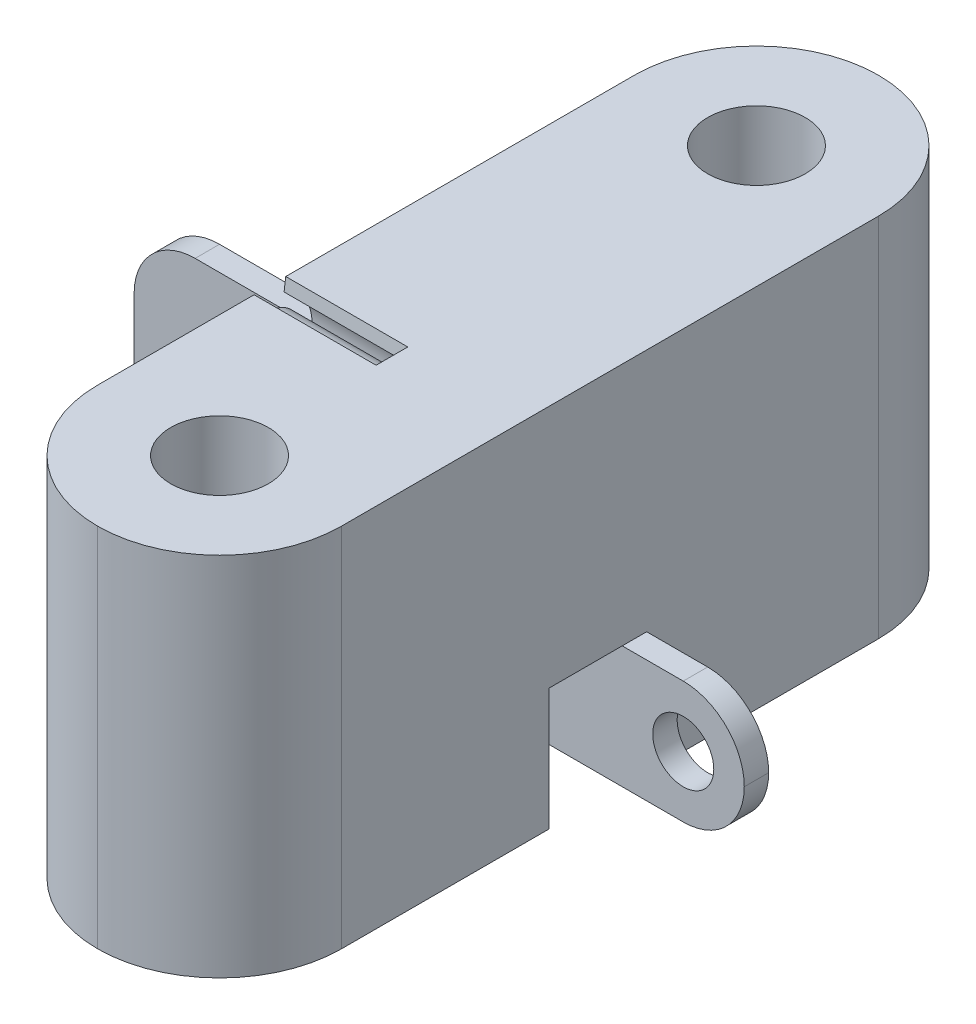
ISO-10303-21;
HEADER;
FILE_DESCRIPTION(('STEP AP214'),'2;1');
FILE_NAME('part.step','',(''),(''),'','','');
FILE_SCHEMA(('AUTOMOTIVE_DESIGN { 1 0 10303 214 1 1 1 1 }'));
ENDSEC;
DATA;
#1=APPLICATION_CONTEXT('core data for automotive mechanical design processes');
#2=APPLICATION_PROTOCOL_DEFINITION('international standard','automotive_design',2000,#1);
#3=PRODUCT_CONTEXT('',#1,'mechanical');
#4=PRODUCT('Part','Part','',(#3));
#5=PRODUCT_RELATED_PRODUCT_CATEGORY('part','',(#4));
#6=PRODUCT_DEFINITION_FORMATION('','',#4);
#7=PRODUCT_DEFINITION_CONTEXT('part definition',#1,'design');
#8=PRODUCT_DEFINITION('design','',#6,#7);
#9=PRODUCT_DEFINITION_SHAPE('','',#8);
#10=(LENGTH_UNIT() NAMED_UNIT(*) SI_UNIT(.MILLI.,.METRE.));
#11=(NAMED_UNIT(*) PLANE_ANGLE_UNIT() SI_UNIT($,.RADIAN.));
#12=(NAMED_UNIT(*) SI_UNIT($,.STERADIAN.) SOLID_ANGLE_UNIT());
#13=UNCERTAINTY_MEASURE_WITH_UNIT(LENGTH_MEASURE(1.E-05),#10,'distance_accuracy_value','');
#14=(GEOMETRIC_REPRESENTATION_CONTEXT(3) GLOBAL_UNCERTAINTY_ASSIGNED_CONTEXT((#13)) GLOBAL_UNIT_ASSIGNED_CONTEXT((#10,
#11,#12)) REPRESENTATION_CONTEXT('',''));
#15=CARTESIAN_POINT('',(0.,0.,0.));
#16=DIRECTION('',(0.,0.,1.));
#17=DIRECTION('',(1.,0.,0.));
#18=AXIS2_PLACEMENT_3D('',#15,#16,#17);
#19=CARTESIAN_POINT('',(0.,0.,0.));
#20=DIRECTION('',(0.,1.,0.));
#21=DIRECTION('',(0.,0.,1.));
#22=AXIS2_PLACEMENT_3D('',#19,#20,#21);
#23=PLANE('',#22);
#24=DIRECTION('',(0.,0.,1.));
#25=VECTOR('',#24,1.);
#26=CARTESIAN_POINT('',(-3.52238805970147,0.,-23.7611940298507));
#27=LINE('',#26,#25);
#28=CARTESIAN_POINT('',(-3.52238805970146,0.,13.2388059701493));
#29=VERTEX_POINT('',#28);
#30=CARTESIAN_POINT('',(-3.52238805970146,0.,30.2388059701493));
#31=VERTEX_POINT('',#30);
#32=EDGE_CURVE('E265',#29,#31,#27,.T.);
#33=ORIENTED_EDGE('',*,*,#32,.F.);
#34=DIRECTION('',(-1.,0.,0.));
#35=VECTOR('',#34,1.);
#36=CARTESIAN_POINT('',(-4.02238805970147,0.,13.2388059701493));
#37=LINE('',#36,#35);
#38=CARTESIAN_POINT('',(16.4776119402985,0.,13.2388059701493));
#39=VERTEX_POINT('',#38);
#40=EDGE_CURVE('E207',#39,#29,#37,.T.);
#41=ORIENTED_EDGE('',*,*,#40,.F.);
#42=DIRECTION('',(0.,0.,-1.));
#43=VECTOR('',#42,1.);
#44=CARTESIAN_POINT('',(16.4776119402985,0.,-23.7611940298507));
#45=LINE('',#44,#43);
#46=CARTESIAN_POINT('',(16.4776119402985,0.,30.2388059701493));
#47=VERTEX_POINT('',#46);
#48=EDGE_CURVE('E283',#47,#39,#45,.T.);
#49=ORIENTED_EDGE('',*,*,#48,.F.);
#50=CARTESIAN_POINT('',(6.47761194029854,0.,30.2388059701493));
#51=DIRECTION('',(0.,1.,0.));
#52=DIRECTION('',(0.,0.,1.));
#53=AXIS2_PLACEMENT_3D('',#50,#51,#52);
#54=CIRCLE('',#53,10.);
#55=CARTESIAN_POINT('',(6.47761194029854,0.,40.2388059701493));
#56=VERTEX_POINT('',#55);
#57=EDGE_CURVE('E293',#47,#56,#54,.F.);
#58=ORIENTED_EDGE('',*,*,#57,.T.);
#59=CARTESIAN_POINT('',(6.47761194029854,0.,30.2388059701493));
#60=DIRECTION('',(0.,1.,0.));
#61=DIRECTION('',(0.,0.,1.));
#62=AXIS2_PLACEMENT_3D('',#59,#60,#61);
#63=CIRCLE('',#62,10.);
#64=EDGE_CURVE('E290',#56,#31,#63,.F.);
#65=ORIENTED_EDGE('',*,*,#64,.T.);
#66=EDGE_LOOP('',(#33,#41,#49,#58,#65));
#67=FACE_BOUND('',#66,.T.);
#68=ADVANCED_FACE('F33',(#67),#23,.F.);
#69=CARTESIAN_POINT('',(-3.52238805970147,30.,-23.7611940298507));
#70=DIRECTION('',(1.,0.,0.));
#71=DIRECTION('',(0.,0.,-1.));
#72=AXIS2_PLACEMENT_3D('',#69,#70,#71);
#73=PLANE('',#72);
#74=DIRECTION('',(0.,0.,1.));
#75=VECTOR('',#74,1.);
#76=CARTESIAN_POINT('',(-3.52238805970147,10.,-23.7611940298507));
#77=LINE('',#76,#75);
#78=CARTESIAN_POINT('',(-3.52238805970147,10.,7.23880597014926));
#79=VERTEX_POINT('',#78);
#80=CARTESIAN_POINT('',(-3.52238805970146,10.,13.2388059701493));
#81=VERTEX_POINT('',#80);
#82=EDGE_CURVE('E186',#79,#81,#77,.T.);
#83=ORIENTED_EDGE('',*,*,#82,.T.);
#84=DIRECTION('',(0.,-1.,0.));
#85=VECTOR('',#84,1.);
#86=CARTESIAN_POINT('',(-3.52238805970146,30.,13.2388059701493));
#87=LINE('',#86,#85);
#88=EDGE_CURVE('E360',#81,#29,#87,.T.);
#89=ORIENTED_EDGE('',*,*,#88,.T.);
#90=ORIENTED_EDGE('',*,*,#32,.T.);
#91=DIRECTION('',(0.,-1.,0.));
#92=VECTOR('',#91,1.);
#93=CARTESIAN_POINT('',(-3.52238805970146,30.,30.2388059701493));
#94=LINE('',#93,#92);
#95=CARTESIAN_POINT('',(-3.52238805970146,30.,30.2388059701493));
#96=VERTEX_POINT('',#95);
#97=EDGE_CURVE('E279',#31,#96,#94,.F.);
#98=ORIENTED_EDGE('',*,*,#97,.T.);
#99=DIRECTION('',(0.,0.,1.));
#100=VECTOR('',#99,1.);
#101=CARTESIAN_POINT('',(-3.52238805970147,30.,-23.7611940298507));
#102=LINE('',#101,#100);
#103=CARTESIAN_POINT('',(-3.52238805970146,30.,17.4075983617578));
#104=VERTEX_POINT('',#103);
#105=EDGE_CURVE('E277',#104,#96,#102,.T.);
#106=ORIENTED_EDGE('',*,*,#105,.F.);
#107=DIRECTION('',(0.,-0.998274373174996,-0.0587220219514735));
#108=VECTOR('',#107,1.);
#109=CARTESIAN_POINT('',(-3.52238805970146,-0.916997145344465,15.5889514708551));
#110=LINE('',#109,#108);
#111=CARTESIAN_POINT('',(-3.52238805970146,28.9802150072761,17.3476110092446));
#112=VERTEX_POINT('',#111);
#113=EDGE_CURVE('E247',#104,#112,#110,.T.);
#114=ORIENTED_EDGE('',*,*,#113,.T.);
#115=CARTESIAN_POINT('',(-3.52238805970146,25.6865831727299,16.1635547021105));
#116=DIRECTION('',(-1.,0.,0.));
#117=DIRECTION('',(0.,0.,1.));
#118=AXIS2_PLACEMENT_3D('',#115,#116,#117);
#119=CIRCLE('',#118,3.5);
#120=CARTESIAN_POINT('',(-3.52238805970146,28.9694464253818,14.9499613334784));
#121=VERTEX_POINT('',#120);
#122=EDGE_CURVE('E243',#121,#112,#119,.T.);
#123=ORIENTED_EDGE('',*,*,#122,.F.);
#124=DIRECTION('',(0.,0.991227900682634,-0.132163720091024));
#125=VECTOR('',#124,1.);
#126=CARTESIAN_POINT('',(-3.52238805970146,2.46452674980748,18.4839506235552));
#127=LINE('',#126,#125);
#128=CARTESIAN_POINT('',(-3.52238805970146,30.,14.812554190196));
#129=VERTEX_POINT('',#128);
#130=EDGE_CURVE('E240',#121,#129,#127,.T.);
#131=ORIENTED_EDGE('',*,*,#130,.T.);
#132=CARTESIAN_POINT('',(-3.52238805970147,30.,-13.7611940298507));
#133=VERTEX_POINT('',#132);
#134=EDGE_CURVE('E274',#133,#129,#102,.T.);
#135=ORIENTED_EDGE('',*,*,#134,.F.);
#136=DIRECTION('',(0.,-1.,0.));
#137=VECTOR('',#136,1.);
#138=CARTESIAN_POINT('',(-3.52238805970147,30.,-13.7611940298507));
#139=LINE('',#138,#137);
#140=CARTESIAN_POINT('',(-3.52238805970147,0.,-13.7611940298507));
#141=VERTEX_POINT('',#140);
#142=EDGE_CURVE('E287',#133,#141,#139,.T.);
#143=ORIENTED_EDGE('',*,*,#142,.T.);
#144=CARTESIAN_POINT('',(-3.52238805970146,0.,5.23880597014926));
#145=VERTEX_POINT('',#144);
#146=EDGE_CURVE('E280',#141,#145,#27,.T.);
#147=ORIENTED_EDGE('',*,*,#146,.T.);
#148=DIRECTION('',(0.,1.,0.));
#149=VECTOR('',#148,1.);
#150=CARTESIAN_POINT('',(-3.52238805970146,30.,5.23880597014926));
#151=LINE('',#150,#149);
#152=CARTESIAN_POINT('',(-3.52238805970146,20.,5.23880597014926));
#153=VERTEX_POINT('',#152);
#154=EDGE_CURVE('E217',#145,#153,#151,.T.);
#155=ORIENTED_EDGE('',*,*,#154,.T.);
#156=DIRECTION('',(0.,0.,-1.));
#157=VECTOR('',#156,1.);
#158=CARTESIAN_POINT('',(-3.52238805970146,20.,40.2398059701493));
#159=LINE('',#158,#157);
#160=CARTESIAN_POINT('',(-3.52238805970146,20.,7.23880597014926));
#161=VERTEX_POINT('',#160);
#162=EDGE_CURVE('E212',#161,#153,#159,.T.);
#163=ORIENTED_EDGE('',*,*,#162,.F.);
#164=DIRECTION('',(0.,-1.,0.));
#165=VECTOR('',#164,1.);
#166=CARTESIAN_POINT('',(-3.52238805970146,30.,7.23880597014926));
#167=LINE('',#166,#165);
#168=EDGE_CURVE('E205',#161,#79,#167,.T.);
#169=ORIENTED_EDGE('',*,*,#168,.T.);
#170=EDGE_LOOP('',(#83,#89,#90,#98,#106,#114,#123,#131,#135,#143,#147,#155,#163,#169));
#171=FACE_BOUND('',#170,.T.);
#172=ADVANCED_FACE('F210',(#171),#73,.F.);
#173=CARTESIAN_POINT('',(0.,30.,0.));
#174=DIRECTION('',(0.,1.,0.));
#175=DIRECTION('',(0.,0.,1.));
#176=AXIS2_PLACEMENT_3D('',#173,#174,#175);
#177=PLANE('',#176);
#178=ORIENTED_EDGE('',*,*,#134,.T.);
#179=DIRECTION('',(-1.,0.,0.));
#180=VECTOR('',#179,1.);
#181=CARTESIAN_POINT('',(6.47761194029853,30.,14.812554190196));
#182=LINE('',#181,#180);
#183=CARTESIAN_POINT('',(6.47761194029853,30.,14.812554190196));
#184=VERTEX_POINT('',#183);
#185=EDGE_CURVE('E252',#184,#129,#182,.T.);
#186=ORIENTED_EDGE('',*,*,#185,.F.);
#187=DIRECTION('',(0.,0.,-1.));
#188=VECTOR('',#187,1.);
#189=CARTESIAN_POINT('',(6.47761194029853,30.,0.));
#190=LINE('',#189,#188);
#191=CARTESIAN_POINT('',(6.47761194029853,30.,17.4075983617578));
#192=VERTEX_POINT('',#191);
#193=EDGE_CURVE('E233',#192,#184,#190,.T.);
#194=ORIENTED_EDGE('',*,*,#193,.F.);
#195=DIRECTION('',(-1.,0.,0.));
#196=VECTOR('',#195,1.);
#197=CARTESIAN_POINT('',(6.47761194029853,30.,17.4075983617578));
#198=LINE('',#197,#196);
#199=EDGE_CURVE('E256',#192,#104,#198,.T.);
#200=ORIENTED_EDGE('',*,*,#199,.T.);
#201=ORIENTED_EDGE('',*,*,#105,.T.);
#202=CARTESIAN_POINT('',(6.47761194029854,30.,30.2388059701493));
#203=DIRECTION('',(0.,1.,0.));
#204=DIRECTION('',(0.,0.,1.));
#205=AXIS2_PLACEMENT_3D('',#202,#203,#204);
#206=CIRCLE('',#205,10.);
#207=CARTESIAN_POINT('',(6.47761194029854,30.,40.2388059701493));
#208=VERTEX_POINT('',#207);
#209=EDGE_CURVE('E300',#96,#208,#206,.T.);
#210=ORIENTED_EDGE('',*,*,#209,.T.);
#211=CARTESIAN_POINT('',(6.47761194029854,30.,30.2388059701493));
#212=DIRECTION('',(0.,1.,0.));
#213=DIRECTION('',(0.,0.,1.));
#214=AXIS2_PLACEMENT_3D('',#211,#212,#213);
#215=CIRCLE('',#214,10.);
#216=CARTESIAN_POINT('',(16.4776119402985,30.,30.2388059701493));
#217=VERTEX_POINT('',#216);
#218=EDGE_CURVE('E302',#208,#217,#215,.T.);
#219=ORIENTED_EDGE('',*,*,#218,.T.);
#220=DIRECTION('',(0.,0.,-1.));
#221=VECTOR('',#220,1.);
#222=CARTESIAN_POINT('',(16.4776119402985,30.,-23.7611940298507));
#223=LINE('',#222,#221);
#224=CARTESIAN_POINT('',(16.4776119402985,30.,-13.7611940298507));
#225=VERTEX_POINT('',#224);
#226=EDGE_CURVE('E276',#217,#225,#223,.T.);
#227=ORIENTED_EDGE('',*,*,#226,.T.);
#228=CARTESIAN_POINT('',(6.47761194029854,30.,-13.7611940298507));
#229=DIRECTION('',(0.,1.,0.));
#230=DIRECTION('',(0.,0.,1.));
#231=AXIS2_PLACEMENT_3D('',#228,#229,#230);
#232=CIRCLE('',#231,10.);
#233=CARTESIAN_POINT('',(6.47761194029854,30.,-23.7611940298507));
#234=VERTEX_POINT('',#233);
#235=EDGE_CURVE('E304',#225,#234,#232,.T.);
#236=ORIENTED_EDGE('',*,*,#235,.T.);
#237=CARTESIAN_POINT('',(6.47761194029853,30.,-13.7611940298507));
#238=DIRECTION('',(0.,1.,0.));
#239=DIRECTION('',(0.,0.,1.));
#240=AXIS2_PLACEMENT_3D('',#237,#238,#239);
#241=CIRCLE('',#240,10.);
#242=EDGE_CURVE('E306',#234,#133,#241,.T.);
#243=ORIENTED_EDGE('',*,*,#242,.T.);
#244=EDGE_LOOP('',(#178,#186,#194,#200,#201,#210,#219,#227,#236,#243));
#245=FACE_BOUND('',#244,.T.);
#246=CARTESIAN_POINT('',(6.47761194029853,30.,30.2388059701493));
#247=DIRECTION('',(0.,1.,0.));
#248=DIRECTION('',(0.,0.,1.));
#249=AXIS2_PLACEMENT_3D('',#246,#247,#248);
#250=CIRCLE('',#249,4.);
#251=CARTESIAN_POINT('',(6.47761194029853,30.,34.2388059701493));
#252=VERTEX_POINT('',#251);
#253=EDGE_CURVE('E255',#252,#252,#250,.T.);
#254=ORIENTED_EDGE('',*,*,#253,.F.);
#255=EDGE_LOOP('',(#254));
#256=FACE_BOUND('',#255,.T.);
#257=CARTESIAN_POINT('',(6.47761194029853,30.,-13.7611940298507));
#258=DIRECTION('',(0.,1.,0.));
#259=DIRECTION('',(0.,0.,1.));
#260=AXIS2_PLACEMENT_3D('',#257,#258,#259);
#261=CIRCLE('',#260,4.);
#262=CARTESIAN_POINT('',(6.47761194029853,30.,-9.76119402985074));
#263=VERTEX_POINT('',#262);
#264=EDGE_CURVE('E266',#263,#263,#261,.T.);
#265=ORIENTED_EDGE('',*,*,#264,.F.);
#266=EDGE_LOOP('',(#265));
#267=FACE_BOUND('',#266,.T.);
#268=ADVANCED_FACE('F438',(#245,#256,#267),#177,.T.);
#269=CARTESIAN_POINT('',(16.4776119402985,30.,-23.7611940298507));
#270=DIRECTION('',(-1.,0.,0.));
#271=DIRECTION('',(0.,0.,1.));
#272=AXIS2_PLACEMENT_3D('',#269,#270,#271);
#273=PLANE('',#272);
#274=ORIENTED_EDGE('',*,*,#48,.T.);
#275=DIRECTION('',(0.,1.,0.));
#276=VECTOR('',#275,1.);
#277=CARTESIAN_POINT('',(16.4776119402985,30.,13.2388059701493));
#278=LINE('',#277,#276);
#279=CARTESIAN_POINT('',(16.4776119402985,10.,13.2388059701493));
#280=VERTEX_POINT('',#279);
#281=EDGE_CURVE('E196',#39,#280,#278,.T.);
#282=ORIENTED_EDGE('',*,*,#281,.T.);
#283=DIRECTION('',(0.,0.,-1.));
#284=VECTOR('',#283,1.);
#285=CARTESIAN_POINT('',(16.4776119402985,10.,-23.7611940298507));
#286=LINE('',#285,#284);
#287=CARTESIAN_POINT('',(16.4776119402985,10.,7.23880597014926));
#288=VERTEX_POINT('',#287);
#289=EDGE_CURVE('E197',#280,#288,#286,.T.);
#290=ORIENTED_EDGE('',*,*,#289,.T.);
#291=DIRECTION('',(0.,0.,-1.));
#292=VECTOR('',#291,1.);
#293=CARTESIAN_POINT('',(16.4776119402985,10.,40.2398059701493));
#294=LINE('',#293,#292);
#295=CARTESIAN_POINT('',(16.4776119402985,10.,5.23880597014926));
#296=VERTEX_POINT('',#295);
#297=EDGE_CURVE('E385',#288,#296,#294,.T.);
#298=ORIENTED_EDGE('',*,*,#297,.T.);
#299=DIRECTION('',(0.,-1.,0.));
#300=VECTOR('',#299,1.);
#301=CARTESIAN_POINT('',(16.4776119402985,30.,5.23880597014925));
#302=LINE('',#301,#300);
#303=CARTESIAN_POINT('',(16.4776119402985,0.,5.23880597014926));
#304=VERTEX_POINT('',#303);
#305=EDGE_CURVE('E213',#296,#304,#302,.T.);
#306=ORIENTED_EDGE('',*,*,#305,.T.);
#307=CARTESIAN_POINT('',(16.4776119402985,0.,-13.7611940298507));
#308=VERTEX_POINT('',#307);
#309=EDGE_CURVE('E282',#304,#308,#45,.T.);
#310=ORIENTED_EDGE('',*,*,#309,.T.);
#311=DIRECTION('',(0.,-1.,0.));
#312=VECTOR('',#311,1.);
#313=CARTESIAN_POINT('',(16.4776119402985,30.,-13.7611940298507));
#314=LINE('',#313,#312);
#315=EDGE_CURVE('E311',#308,#225,#314,.F.);
#316=ORIENTED_EDGE('',*,*,#315,.T.);
#317=ORIENTED_EDGE('',*,*,#226,.F.);
#318=DIRECTION('',(0.,-1.,0.));
#319=VECTOR('',#318,1.);
#320=CARTESIAN_POINT('',(16.4776119402985,30.,30.2388059701493));
#321=LINE('',#320,#319);
#322=EDGE_CURVE('E308',#217,#47,#321,.T.);
#323=ORIENTED_EDGE('',*,*,#322,.T.);
#324=EDGE_LOOP('',(#274,#282,#290,#298,#306,#310,#316,#317,#323));
#325=FACE_BOUND('',#324,.T.);
#326=ADVANCED_FACE('F445',(#325),#273,.F.);
#327=DIRECTION('',(0.,0.,1.));
#328=VECTOR('',#327,1.);
#329=CARTESIAN_POINT('',(21.4776119402985,0.,0.));
#330=LINE('',#329,#328);
#331=CARTESIAN_POINT('',(21.4776119402985,0.,5.23880597014926));
#332=VERTEX_POINT('',#331);
#333=CARTESIAN_POINT('',(21.4776119402985,0.,7.23880597014926));
#334=VERTEX_POINT('',#333);
#335=EDGE_CURVE('E334',#332,#334,#330,.T.);
#336=ORIENTED_EDGE('',*,*,#335,.T.);
#337=DIRECTION('',(-1.,0.,0.));
#338=VECTOR('',#337,1.);
#339=CARTESIAN_POINT('',(26.4776119402985,0.,7.23880597014926));
#340=LINE('',#339,#338);
#341=CARTESIAN_POINT('',(-18.5223880597015,0.,7.23880597014926));
#342=VERTEX_POINT('',#341);
#343=EDGE_CURVE('E214',#334,#342,#340,.T.);
#344=ORIENTED_EDGE('',*,*,#343,.T.);
#345=DIRECTION('',(0.,0.,1.));
#346=VECTOR('',#345,1.);
#347=CARTESIAN_POINT('',(-18.5223880597015,0.,5.23880597014926));
#348=LINE('',#347,#346);
#349=CARTESIAN_POINT('',(-18.5223880597015,0.,5.23880597014926));
#350=VERTEX_POINT('',#349);
#351=EDGE_CURVE('E337',#342,#350,#348,.F.);
#352=ORIENTED_EDGE('',*,*,#351,.T.);
#353=DIRECTION('',(-1.,0.,0.));
#354=VECTOR('',#353,1.);
#355=CARTESIAN_POINT('',(26.4776119402985,0.,5.23880597014926));
#356=LINE('',#355,#354);
#357=EDGE_CURVE('E354',#145,#350,#356,.T.);
#358=ORIENTED_EDGE('',*,*,#357,.F.);
#359=ORIENTED_EDGE('',*,*,#146,.F.);
#360=CARTESIAN_POINT('',(6.47761194029853,0.,-13.7611940298507));
#361=DIRECTION('',(0.,1.,0.));
#362=DIRECTION('',(0.,0.,1.));
#363=AXIS2_PLACEMENT_3D('',#360,#361,#362);
#364=CIRCLE('',#363,10.);
#365=CARTESIAN_POINT('',(6.47761194029854,0.,-23.7611940298507));
#366=VERTEX_POINT('',#365);
#367=EDGE_CURVE('E298',#141,#366,#364,.F.);
#368=ORIENTED_EDGE('',*,*,#367,.T.);
#369=CARTESIAN_POINT('',(6.47761194029854,0.,-13.7611940298507));
#370=DIRECTION('',(0.,1.,0.));
#371=DIRECTION('',(0.,0.,1.));
#372=AXIS2_PLACEMENT_3D('',#369,#370,#371);
#373=CIRCLE('',#372,10.);
#374=EDGE_CURVE('E295',#366,#308,#373,.F.);
#375=ORIENTED_EDGE('',*,*,#374,.T.);
#376=ORIENTED_EDGE('',*,*,#309,.F.);
#377=EDGE_CURVE('E219',#332,#304,#356,.T.);
#378=ORIENTED_EDGE('',*,*,#377,.F.);
#379=EDGE_LOOP('',(#336,#344,#352,#358,#359,#368,#375,#376,#378));
#380=FACE_BOUND('',#379,.T.);
#381=ADVANCED_FACE('F353',(#380),#23,.F.);
#382=CARTESIAN_POINT('',(6.47761194029853,10.,30.2388059701493));
#383=DIRECTION('',(0.,1.,0.));
#384=DIRECTION('',(0.,0.,1.));
#385=AXIS2_PLACEMENT_3D('',#382,#383,#384);
#386=CYLINDRICAL_SURFACE('',#385,4.);
#387=CARTESIAN_POINT('',(6.47761194029853,10.,30.2388059701493));
#388=DIRECTION('',(0.,1.,0.));
#389=DIRECTION('',(0.,0.,1.));
#390=AXIS2_PLACEMENT_3D('',#387,#388,#389);
#391=CIRCLE('',#390,4.);
#392=CARTESIAN_POINT('',(6.47761194029853,10.,34.2388059701493));
#393=VERTEX_POINT('',#392);
#394=EDGE_CURVE('E269',#393,#393,#391,.T.);
#395=ORIENTED_EDGE('',*,*,#394,.F.);
#396=EDGE_LOOP('',(#395));
#397=FACE_BOUND('',#396,.T.);
#398=ORIENTED_EDGE('',*,*,#253,.T.);
#399=EDGE_LOOP('',(#398));
#400=FACE_BOUND('',#399,.T.);
#401=ADVANCED_FACE('F444',(#397,#400),#386,.F.);
#402=CARTESIAN_POINT('',(6.47761194029853,10.,30.2388059701493));
#403=DIRECTION('',(0.,1.,0.));
#404=DIRECTION('',(0.,0.,1.));
#405=AXIS2_PLACEMENT_3D('',#402,#403,#404);
#406=PLANE('',#405);
#407=ORIENTED_EDGE('',*,*,#394,.T.);
#408=EDGE_LOOP('',(#407));
#409=FACE_BOUND('',#408,.T.);
#410=ADVANCED_FACE('F451',(#409),#406,.T.);
#411=CARTESIAN_POINT('',(6.47761194029853,10.,-13.7611940298507));
#412=DIRECTION('',(0.,1.,0.));
#413=DIRECTION('',(0.,0.,1.));
#414=AXIS2_PLACEMENT_3D('',#411,#412,#413);
#415=CYLINDRICAL_SURFACE('',#414,4.);
#416=CARTESIAN_POINT('',(6.47761194029853,10.,-13.7611940298507));
#417=DIRECTION('',(0.,1.,0.));
#418=DIRECTION('',(0.,0.,1.));
#419=AXIS2_PLACEMENT_3D('',#416,#417,#418);
#420=CIRCLE('',#419,4.);
#421=CARTESIAN_POINT('',(6.47761194029853,10.,-9.76119402985074));
#422=VERTEX_POINT('',#421);
#423=EDGE_CURVE('E262',#422,#422,#420,.T.);
#424=ORIENTED_EDGE('',*,*,#423,.F.);
#425=EDGE_LOOP('',(#424));
#426=FACE_BOUND('',#425,.T.);
#427=ORIENTED_EDGE('',*,*,#264,.T.);
#428=EDGE_LOOP('',(#427));
#429=FACE_BOUND('',#428,.T.);
#430=ADVANCED_FACE('F621',(#426,#429),#415,.F.);
#431=CARTESIAN_POINT('',(6.47761194029853,10.,-13.7611940298507));
#432=DIRECTION('',(0.,1.,0.));
#433=DIRECTION('',(0.,0.,1.));
#434=AXIS2_PLACEMENT_3D('',#431,#432,#433);
#435=PLANE('',#434);
#436=ORIENTED_EDGE('',*,*,#423,.T.);
#437=EDGE_LOOP('',(#436));
#438=FACE_BOUND('',#437,.T.);
#439=ADVANCED_FACE('F611',(#438),#435,.T.);
#440=CARTESIAN_POINT('',(6.47761194029853,2.46452674980748,18.4839506235552));
#441=DIRECTION('',(0.,0.132163720091024,0.991227900682634));
#442=DIRECTION('',(0.,-0.991227900682634,0.132163720091024));
#443=AXIS2_PLACEMENT_3D('',#440,#441,#442);
#444=PLANE('',#443);
#445=ORIENTED_EDGE('',*,*,#130,.F.);
#446=DIRECTION('',(-1.,0.,0.));
#447=VECTOR('',#446,1.);
#448=CARTESIAN_POINT('',(6.47761194029853,28.9694464253818,14.9499613334784));
#449=LINE('',#448,#447);
#450=CARTESIAN_POINT('',(6.47761194029853,28.9694464253818,14.9499613334784));
#451=VERTEX_POINT('',#450);
#452=EDGE_CURVE('E239',#451,#121,#449,.T.);
#453=ORIENTED_EDGE('',*,*,#452,.F.);
#454=DIRECTION('',(0.,0.991227900682634,-0.132163720091024));
#455=VECTOR('',#454,1.);
#456=CARTESIAN_POINT('',(6.47761194029853,2.46452674980748,18.4839506235552));
#457=LINE('',#456,#455);
#458=EDGE_CURVE('E225',#451,#184,#457,.T.);
#459=ORIENTED_EDGE('',*,*,#458,.T.);
#460=ORIENTED_EDGE('',*,*,#185,.T.);
#461=EDGE_LOOP('',(#445,#453,#459,#460));
#462=FACE_BOUND('',#461,.T.);
#463=ADVANCED_FACE('F601',(#462),#444,.T.);
#464=CARTESIAN_POINT('',(6.47761194029853,-0.916997145344465,15.5889514708551));
#465=DIRECTION('',(0.,0.0587220219514735,-0.998274373174996));
#466=DIRECTION('',(0.,0.998274373174996,0.0587220219514735));
#467=AXIS2_PLACEMENT_3D('',#464,#465,#466);
#468=PLANE('',#467);
#469=ORIENTED_EDGE('',*,*,#113,.F.);
#470=ORIENTED_EDGE('',*,*,#199,.F.);
#471=DIRECTION('',(0.,-0.998274373174996,-0.0587220219514735));
#472=VECTOR('',#471,1.);
#473=CARTESIAN_POINT('',(6.47761194029853,-0.916997145344465,15.5889514708551));
#474=LINE('',#473,#472);
#475=CARTESIAN_POINT('',(6.47761194029853,28.9802150072761,17.3476110092446));
#476=VERTEX_POINT('',#475);
#477=EDGE_CURVE('E231',#192,#476,#474,.T.);
#478=ORIENTED_EDGE('',*,*,#477,.T.);
#479=DIRECTION('',(-1.,0.,0.));
#480=VECTOR('',#479,1.);
#481=CARTESIAN_POINT('',(6.47761194029853,28.9802150072761,17.3476110092446));
#482=LINE('',#481,#480);
#483=EDGE_CURVE('E259',#476,#112,#482,.T.);
#484=ORIENTED_EDGE('',*,*,#483,.T.);
#485=EDGE_LOOP('',(#469,#470,#478,#484));
#486=FACE_BOUND('',#485,.T.);
#487=ADVANCED_FACE('F591',(#486),#468,.T.);
#488=CARTESIAN_POINT('',(6.47761194029853,25.6865831727299,16.1635547021105));
#489=DIRECTION('',(-1.,0.,0.));
#490=DIRECTION('',(0.,0.,1.));
#491=AXIS2_PLACEMENT_3D('',#488,#489,#490);
#492=CYLINDRICAL_SURFACE('',#491,3.5);
#493=ORIENTED_EDGE('',*,*,#122,.T.);
#494=ORIENTED_EDGE('',*,*,#483,.F.);
#495=CARTESIAN_POINT('',(6.47761194029853,25.6865831727299,16.1635547021105));
#496=DIRECTION('',(-1.,0.,0.));
#497=DIRECTION('',(0.,0.,1.));
#498=AXIS2_PLACEMENT_3D('',#495,#496,#497);
#499=CIRCLE('',#498,3.5);
#500=EDGE_CURVE('E227',#451,#476,#499,.T.);
#501=ORIENTED_EDGE('',*,*,#500,.F.);
#502=ORIENTED_EDGE('',*,*,#452,.T.);
#503=EDGE_LOOP('',(#493,#494,#501,#502));
#504=FACE_BOUND('',#503,.T.);
#505=ADVANCED_FACE('F581',(#504),#492,.F.);
#506=CARTESIAN_POINT('',(6.47761194029853,25.6865831727299,16.1635547021105));
#507=DIRECTION('',(-1.,0.,0.));
#508=DIRECTION('',(0.,0.,1.));
#509=AXIS2_PLACEMENT_3D('',#506,#507,#508);
#510=CYLINDRICAL_SURFACE('',#509,2.5);
#511=CARTESIAN_POINT('',(6.47761194029853,25.6865831727299,16.1635547021105));
#512=DIRECTION('',(-1.,0.,0.));
#513=DIRECTION('',(0.,0.,1.));
#514=AXIS2_PLACEMENT_3D('',#511,#512,#513);
#515=CIRCLE('',#514,2.5);
#516=CARTESIAN_POINT('',(6.47761194029853,25.6865831727299,18.6635547021105));
#517=VERTEX_POINT('',#516);
#518=EDGE_CURVE('E236',#517,#517,#515,.T.);
#519=ORIENTED_EDGE('',*,*,#518,.T.);
#520=EDGE_LOOP('',(#519));
#521=FACE_BOUND('',#520,.T.);
#522=CARTESIAN_POINT('',(-3.52238805970146,25.6865831727299,16.1635547021105));
#523=DIRECTION('',(-1.,0.,0.));
#524=DIRECTION('',(0.,0.,1.));
#525=AXIS2_PLACEMENT_3D('',#522,#523,#524);
#526=CIRCLE('',#525,2.5);
#527=CARTESIAN_POINT('',(-3.52238805970146,25.6865831727299,18.6635547021105));
#528=VERTEX_POINT('',#527);
#529=EDGE_CURVE('E228',#528,#528,#526,.T.);
#530=ORIENTED_EDGE('',*,*,#529,.F.);
#531=EDGE_LOOP('',(#530));
#532=FACE_BOUND('',#531,.T.);
#533=ADVANCED_FACE('F570',(#521,#532),#510,.T.);
#534=CARTESIAN_POINT('',(6.47761194029853,0.,0.));
#535=DIRECTION('',(-1.,0.,0.));
#536=DIRECTION('',(0.,0.,1.));
#537=AXIS2_PLACEMENT_3D('',#534,#535,#536);
#538=PLANE('',#537);
#539=ORIENTED_EDGE('',*,*,#458,.F.);
#540=ORIENTED_EDGE('',*,*,#500,.T.);
#541=ORIENTED_EDGE('',*,*,#477,.F.);
#542=ORIENTED_EDGE('',*,*,#193,.T.);
#543=EDGE_LOOP('',(#539,#540,#541,#542));
#544=FACE_BOUND('',#543,.T.);
#545=ORIENTED_EDGE('',*,*,#518,.F.);
#546=EDGE_LOOP('',(#545));
#547=FACE_BOUND('',#546,.T.);
#548=ADVANCED_FACE('F561',(#544,#547),#538,.T.);
#549=ORIENTED_EDGE('',*,*,#529,.T.);
#550=EDGE_LOOP('',(#549));
#551=FACE_BOUND('',#550,.T.);
#552=ADVANCED_FACE('F440',(#551),#73,.F.);
#553=CARTESIAN_POINT('',(6.47761194029854,30.,-13.7611940298507));
#554=DIRECTION('',(0.,-1.,0.));
#555=DIRECTION('',(0.,0.,-1.));
#556=AXIS2_PLACEMENT_3D('',#553,#554,#555);
#557=CYLINDRICAL_SURFACE('',#556,10.);
#558=DIRECTION('',(0.,-1.,0.));
#559=VECTOR('',#558,1.);
#560=CARTESIAN_POINT('',(6.47761194029854,30.,-23.7611940298507));
#561=LINE('',#560,#559);
#562=EDGE_CURVE('E244',#234,#366,#561,.T.);
#563=ORIENTED_EDGE('',*,*,#562,.F.);
#564=ORIENTED_EDGE('',*,*,#235,.F.);
#565=ORIENTED_EDGE('',*,*,#315,.F.);
#566=ORIENTED_EDGE('',*,*,#374,.F.);
#567=EDGE_LOOP('',(#563,#564,#565,#566));
#568=FACE_BOUND('',#567,.T.);
#569=ADVANCED_FACE('F464',(#568),#557,.T.);
#570=CARTESIAN_POINT('',(6.47761194029853,30.,-13.7611940298507));
#571=DIRECTION('',(0.,-1.,0.));
#572=DIRECTION('',(0.,0.,-1.));
#573=AXIS2_PLACEMENT_3D('',#570,#571,#572);
#574=CYLINDRICAL_SURFACE('',#573,10.);
#575=ORIENTED_EDGE('',*,*,#242,.F.);
#576=ORIENTED_EDGE('',*,*,#562,.T.);
#577=ORIENTED_EDGE('',*,*,#367,.F.);
#578=ORIENTED_EDGE('',*,*,#142,.F.);
#579=EDGE_LOOP('',(#575,#576,#577,#578));
#580=FACE_BOUND('',#579,.T.);
#581=ADVANCED_FACE('F460',(#580),#574,.T.);
#582=CARTESIAN_POINT('',(6.47761194029854,30.,30.2388059701493));
#583=DIRECTION('',(0.,-1.,0.));
#584=DIRECTION('',(0.,0.,-1.));
#585=AXIS2_PLACEMENT_3D('',#582,#583,#584);
#586=CYLINDRICAL_SURFACE('',#585,10.);
#587=DIRECTION('',(0.,-1.,0.));
#588=VECTOR('',#587,1.);
#589=CARTESIAN_POINT('',(6.47761194029854,30.,40.2388059701493));
#590=LINE('',#589,#588);
#591=EDGE_CURVE('E224',#208,#56,#590,.T.);
#592=ORIENTED_EDGE('',*,*,#591,.F.);
#593=ORIENTED_EDGE('',*,*,#209,.F.);
#594=ORIENTED_EDGE('',*,*,#97,.F.);
#595=ORIENTED_EDGE('',*,*,#64,.F.);
#596=EDGE_LOOP('',(#592,#593,#594,#595));
#597=FACE_BOUND('',#596,.T.);
#598=ADVANCED_FACE('F463',(#597),#586,.T.);
#599=CARTESIAN_POINT('',(6.47761194029854,30.,30.2388059701493));
#600=DIRECTION('',(0.,-1.,0.));
#601=DIRECTION('',(0.,0.,-1.));
#602=AXIS2_PLACEMENT_3D('',#599,#600,#601);
#603=CYLINDRICAL_SURFACE('',#602,10.);
#604=ORIENTED_EDGE('',*,*,#218,.F.);
#605=ORIENTED_EDGE('',*,*,#591,.T.);
#606=ORIENTED_EDGE('',*,*,#57,.F.);
#607=ORIENTED_EDGE('',*,*,#322,.F.);
#608=EDGE_LOOP('',(#604,#605,#606,#607));
#609=FACE_BOUND('',#608,.T.);
#610=ADVANCED_FACE('F469',(#609),#603,.T.);
#611=CARTESIAN_POINT('',(26.4776119402985,30.,5.23880597014925));
#612=DIRECTION('',(0.,0.,-1.));
#613=DIRECTION('',(-1.,0.,0.));
#614=AXIS2_PLACEMENT_3D('',#611,#612,#613);
#615=PLANE('',#614);
#616=CARTESIAN_POINT('',(21.4776119402985,5.,5.23880597014926));
#617=DIRECTION('',(0.,0.,-1.));
#618=DIRECTION('',(-1.,0.,0.));
#619=AXIS2_PLACEMENT_3D('',#616,#617,#618);
#620=CIRCLE('',#619,2.5);
#621=CARTESIAN_POINT('',(18.9776119402985,5.,5.23880597014926));
#622=VERTEX_POINT('',#621);
#623=EDGE_CURVE('E372',#622,#622,#620,.T.);
#624=ORIENTED_EDGE('',*,*,#623,.F.);
#625=EDGE_LOOP('',(#624));
#626=FACE_BOUND('',#625,.T.);
#627=CARTESIAN_POINT('',(21.4776119402985,5.,5.23880597014926));
#628=DIRECTION('',(0.,0.,-1.));
#629=DIRECTION('',(-1.,0.,0.));
#630=AXIS2_PLACEMENT_3D('',#627,#628,#629);
#631=CIRCLE('',#630,5.);
#632=CARTESIAN_POINT('',(21.4776119402985,10.,5.23880597014925));
#633=VERTEX_POINT('',#632);
#634=CARTESIAN_POINT('',(26.4776119402985,5.,5.23880597014925));
#635=VERTEX_POINT('',#634);
#636=EDGE_CURVE('E49',#633,#635,#631,.T.);
#637=ORIENTED_EDGE('',*,*,#636,.T.);
#638=CARTESIAN_POINT('',(21.4776119402985,5.,5.23880597014926));
#639=DIRECTION('',(0.,0.,-1.));
#640=DIRECTION('',(-1.,0.,0.));
#641=AXIS2_PLACEMENT_3D('',#638,#639,#640);
#642=CIRCLE('',#641,5.);
#643=EDGE_CURVE('E42',#635,#332,#642,.T.);
#644=ORIENTED_EDGE('',*,*,#643,.T.);
#645=ORIENTED_EDGE('',*,*,#377,.T.);
#646=ORIENTED_EDGE('',*,*,#305,.F.);
#647=DIRECTION('',(-1.,0.,0.));
#648=VECTOR('',#647,1.);
#649=CARTESIAN_POINT('',(26.4776119402985,10.,5.23880597014925));
#650=LINE('',#649,#648);
#651=EDGE_CURVE('E375',#633,#296,#650,.T.);
#652=ORIENTED_EDGE('',*,*,#651,.F.);
#653=EDGE_LOOP('',(#637,#644,#645,#646,#652));
#654=FACE_BOUND('',#653,.T.);
#655=ADVANCED_FACE('F346',(#626,#654),#615,.T.);
#656=DIRECTION('',(0.,-1.,0.));
#657=VECTOR('',#656,1.);
#658=CARTESIAN_POINT('',(-23.5223880597015,30.,5.23880597014926));
#659=LINE('',#658,#657);
#660=CARTESIAN_POINT('',(-23.5223880597015,15.,5.23880597014926));
#661=VERTEX_POINT('',#660);
#662=CARTESIAN_POINT('',(-23.5223880597015,5.,5.23880597014926));
#663=VERTEX_POINT('',#662);
#664=EDGE_CURVE('E389',#661,#663,#659,.T.);
#665=ORIENTED_EDGE('',*,*,#664,.F.);
#666=CARTESIAN_POINT('',(-18.5223880597015,15.,5.23880597014926));
#667=DIRECTION('',(0.,0.,-1.));
#668=DIRECTION('',(-1.,0.,0.));
#669=AXIS2_PLACEMENT_3D('',#666,#667,#668);
#670=CIRCLE('',#669,5.);
#671=CARTESIAN_POINT('',(-18.5223880597015,20.,5.23880597014926));
#672=VERTEX_POINT('',#671);
#673=EDGE_CURVE('E326',#661,#672,#670,.T.);
#674=ORIENTED_EDGE('',*,*,#673,.T.);
#675=DIRECTION('',(-1.,0.,0.));
#676=VECTOR('',#675,1.);
#677=CARTESIAN_POINT('',(-3.52238805970146,20.,5.23880597014926));
#678=LINE('',#677,#676);
#679=EDGE_CURVE('E370',#153,#672,#678,.T.);
#680=ORIENTED_EDGE('',*,*,#679,.F.);
#681=ORIENTED_EDGE('',*,*,#154,.F.);
#682=ORIENTED_EDGE('',*,*,#357,.T.);
#683=CARTESIAN_POINT('',(-18.5223880597015,5.,5.23880597014926));
#684=DIRECTION('',(0.,0.,-1.));
#685=DIRECTION('',(-1.,0.,0.));
#686=AXIS2_PLACEMENT_3D('',#683,#684,#685);
#687=CIRCLE('',#686,5.);
#688=EDGE_CURVE('E324',#350,#663,#687,.T.);
#689=ORIENTED_EDGE('',*,*,#688,.T.);
#690=EDGE_LOOP('',(#665,#674,#680,#681,#682,#689));
#691=FACE_BOUND('',#690,.T.);
#692=CARTESIAN_POINT('',(-13.5223880597015,5.,5.23880597014926));
#693=DIRECTION('',(0.,0.,-1.));
#694=DIRECTION('',(-1.,0.,0.));
#695=AXIS2_PLACEMENT_3D('',#692,#693,#694);
#696=CIRCLE('',#695,2.5);
#697=CARTESIAN_POINT('',(-16.0223880597015,5.,5.23880597014926));
#698=VERTEX_POINT('',#697);
#699=EDGE_CURVE('E362',#698,#698,#696,.T.);
#700=ORIENTED_EDGE('',*,*,#699,.F.);
#701=EDGE_LOOP('',(#700));
#702=FACE_BOUND('',#701,.T.);
#703=ADVANCED_FACE('F403',(#691,#702),#615,.T.);
#704=CARTESIAN_POINT('',(26.4776119402985,30.,7.23880597014925));
#705=DIRECTION('',(0.,0.,1.));
#706=DIRECTION('',(1.,0.,0.));
#707=AXIS2_PLACEMENT_3D('',#704,#705,#706);
#708=PLANE('',#707);
#709=CARTESIAN_POINT('',(-18.5223880597015,5.,7.23880597014926));
#710=DIRECTION('',(0.,0.,1.));
#711=DIRECTION('',(1.,0.,0.));
#712=AXIS2_PLACEMENT_3D('',#709,#710,#711);
#713=CIRCLE('',#712,5.);
#714=CARTESIAN_POINT('',(-23.5223880597015,5.,7.23880597014926));
#715=VERTEX_POINT('',#714);
#716=EDGE_CURVE('E330',#715,#342,#713,.T.);
#717=ORIENTED_EDGE('',*,*,#716,.T.);
#718=ORIENTED_EDGE('',*,*,#343,.F.);
#719=CARTESIAN_POINT('',(21.4776119402985,5.,7.23880597014926));
#720=DIRECTION('',(0.,0.,1.));
#721=DIRECTION('',(1.,0.,0.));
#722=AXIS2_PLACEMENT_3D('',#719,#720,#721);
#723=CIRCLE('',#722,5.);
#724=CARTESIAN_POINT('',(26.4776119402985,5.,7.23880597014925));
#725=VERTEX_POINT('',#724);
#726=EDGE_CURVE('E341',#334,#725,#723,.T.);
#727=ORIENTED_EDGE('',*,*,#726,.T.);
#728=CARTESIAN_POINT('',(21.4776119402985,5.,7.23880597014926));
#729=DIRECTION('',(0.,0.,1.));
#730=DIRECTION('',(1.,0.,0.));
#731=AXIS2_PLACEMENT_3D('',#728,#729,#730);
#732=CIRCLE('',#731,5.);
#733=CARTESIAN_POINT('',(21.4776119402985,10.,7.23880597014925));
#734=VERTEX_POINT('',#733);
#735=EDGE_CURVE('E339',#725,#734,#732,.T.);
#736=ORIENTED_EDGE('',*,*,#735,.T.);
#737=DIRECTION('',(-1.,0.,0.));
#738=VECTOR('',#737,1.);
#739=CARTESIAN_POINT('',(26.4776119402985,10.,7.23880597014925));
#740=LINE('',#739,#738);
#741=EDGE_CURVE('E206',#734,#288,#740,.T.);
#742=ORIENTED_EDGE('',*,*,#741,.T.);
#743=DIRECTION('',(1.,0.,0.));
#744=VECTOR('',#743,1.);
#745=CARTESIAN_POINT('',(-4.02238805970147,10.,7.23880597014926));
#746=LINE('',#745,#744);
#747=EDGE_CURVE('E189',#79,#288,#746,.T.);
#748=ORIENTED_EDGE('',*,*,#747,.F.);
#749=ORIENTED_EDGE('',*,*,#168,.F.);
#750=DIRECTION('',(-1.,0.,0.));
#751=VECTOR('',#750,1.);
#752=CARTESIAN_POINT('',(-3.52238805970146,20.,7.23880597014926));
#753=LINE('',#752,#751);
#754=CARTESIAN_POINT('',(-18.5223880597015,20.,7.23880597014926));
#755=VERTEX_POINT('',#754);
#756=EDGE_CURVE('E379',#161,#755,#753,.T.);
#757=ORIENTED_EDGE('',*,*,#756,.T.);
#758=CARTESIAN_POINT('',(-18.5223880597015,15.,7.23880597014926));
#759=DIRECTION('',(0.,0.,1.));
#760=DIRECTION('',(1.,0.,0.));
#761=AXIS2_PLACEMENT_3D('',#758,#759,#760);
#762=CIRCLE('',#761,5.);
#763=CARTESIAN_POINT('',(-23.5223880597015,15.,7.23880597014926));
#764=VERTEX_POINT('',#763);
#765=EDGE_CURVE('E332',#755,#764,#762,.T.);
#766=ORIENTED_EDGE('',*,*,#765,.T.);
#767=DIRECTION('',(0.,1.,0.));
#768=VECTOR('',#767,1.);
#769=CARTESIAN_POINT('',(-23.5223880597015,30.,7.23880597014926));
#770=LINE('',#769,#768);
#771=EDGE_CURVE('E392',#715,#764,#770,.T.);
#772=ORIENTED_EDGE('',*,*,#771,.F.);
#773=EDGE_LOOP('',(#717,#718,#727,#736,#742,#748,#749,#757,#766,#772));
#774=FACE_BOUND('',#773,.T.);
#775=CARTESIAN_POINT('',(-13.5223880597015,5.,7.23880597014926));
#776=DIRECTION('',(0.,0.,1.));
#777=DIRECTION('',(1.,0.,0.));
#778=AXIS2_PLACEMENT_3D('',#775,#776,#777);
#779=CIRCLE('',#778,2.5);
#780=CARTESIAN_POINT('',(-11.0223880597015,5.,7.23880597014926));
#781=VERTEX_POINT('',#780);
#782=EDGE_CURVE('E359',#781,#781,#779,.F.);
#783=ORIENTED_EDGE('',*,*,#782,.T.);
#784=EDGE_LOOP('',(#783));
#785=FACE_BOUND('',#784,.T.);
#786=CARTESIAN_POINT('',(21.4776119402985,5.,7.23880597014926));
#787=DIRECTION('',(0.,0.,1.));
#788=DIRECTION('',(1.,0.,0.));
#789=AXIS2_PLACEMENT_3D('',#786,#787,#788);
#790=CIRCLE('',#789,2.5);
#791=CARTESIAN_POINT('',(23.9776119402985,5.,7.23880597014926));
#792=VERTEX_POINT('',#791);
#793=EDGE_CURVE('E376',#792,#792,#790,.F.);
#794=ORIENTED_EDGE('',*,*,#793,.T.);
#795=EDGE_LOOP('',(#794));
#796=FACE_BOUND('',#795,.T.);
#797=ADVANCED_FACE('F202',(#774,#785,#796),#708,.T.);
#798=CARTESIAN_POINT('',(-23.5223880597015,0.,0.));
#799=DIRECTION('',(-1.,0.,0.));
#800=DIRECTION('',(0.,0.,1.));
#801=AXIS2_PLACEMENT_3D('',#798,#799,#800);
#802=PLANE('',#801);
#803=ORIENTED_EDGE('',*,*,#771,.T.);
#804=DIRECTION('',(0.,0.,-1.));
#805=VECTOR('',#804,1.);
#806=CARTESIAN_POINT('',(-23.5223880597015,15.,5.23880597014926));
#807=LINE('',#806,#805);
#808=EDGE_CURVE('E321',#764,#661,#807,.T.);
#809=ORIENTED_EDGE('',*,*,#808,.T.);
#810=ORIENTED_EDGE('',*,*,#664,.T.);
#811=DIRECTION('',(0.,0.,1.));
#812=VECTOR('',#811,1.);
#813=CARTESIAN_POINT('',(-23.5223880597015,5.,7.23880597014926));
#814=LINE('',#813,#812);
#815=EDGE_CURVE('E314',#663,#715,#814,.T.);
#816=ORIENTED_EDGE('',*,*,#815,.T.);
#817=EDGE_LOOP('',(#803,#809,#810,#816));
#818=FACE_BOUND('',#817,.T.);
#819=ADVANCED_FACE('F411',(#818),#802,.T.);
#820=CARTESIAN_POINT('',(-3.52238805970146,20.,40.2398059701493));
#821=DIRECTION('',(0.,-1.,0.));
#822=DIRECTION('',(0.,0.,-1.));
#823=AXIS2_PLACEMENT_3D('',#820,#821,#822);
#824=PLANE('',#823);
#825=ORIENTED_EDGE('',*,*,#679,.T.);
#826=DIRECTION('',(0.,0.,-1.));
#827=VECTOR('',#826,1.);
#828=CARTESIAN_POINT('',(-18.5223880597015,20.,7.23880597014926));
#829=LINE('',#828,#827);
#830=EDGE_CURVE('E328',#672,#755,#829,.F.);
#831=ORIENTED_EDGE('',*,*,#830,.T.);
#832=ORIENTED_EDGE('',*,*,#756,.F.);
#833=ORIENTED_EDGE('',*,*,#162,.T.);
#834=EDGE_LOOP('',(#825,#831,#832,#833));
#835=FACE_BOUND('',#834,.T.);
#836=ADVANCED_FACE('F417',(#835),#824,.F.);
#837=CARTESIAN_POINT('',(-13.5223880597015,5.,40.2398059701493));
#838=DIRECTION('',(0.,0.,-1.));
#839=DIRECTION('',(-1.,0.,0.));
#840=AXIS2_PLACEMENT_3D('',#837,#838,#839);
#841=CYLINDRICAL_SURFACE('',#840,2.5);
#842=ORIENTED_EDGE('',*,*,#782,.F.);
#843=EDGE_LOOP('',(#842));
#844=FACE_BOUND('',#843,.T.);
#845=ORIENTED_EDGE('',*,*,#699,.T.);
#846=EDGE_LOOP('',(#845));
#847=FACE_BOUND('',#846,.T.);
#848=ADVANCED_FACE('F419',(#844,#847),#841,.F.);
#849=CARTESIAN_POINT('',(26.4776119402985,10.,40.2398059701493));
#850=DIRECTION('',(0.,-1.,0.));
#851=DIRECTION('',(0.,0.,-1.));
#852=AXIS2_PLACEMENT_3D('',#849,#850,#851);
#853=PLANE('',#852);
#854=ORIENTED_EDGE('',*,*,#741,.F.);
#855=DIRECTION('',(0.,0.,-1.));
#856=VECTOR('',#855,1.);
#857=CARTESIAN_POINT('',(21.4776119402985,10.,40.2398059701493));
#858=LINE('',#857,#856);
#859=EDGE_CURVE('E11',#734,#633,#858,.T.);
#860=ORIENTED_EDGE('',*,*,#859,.T.);
#861=ORIENTED_EDGE('',*,*,#651,.T.);
#862=ORIENTED_EDGE('',*,*,#297,.F.);
#863=EDGE_LOOP('',(#854,#860,#861,#862));
#864=FACE_BOUND('',#863,.T.);
#865=ADVANCED_FACE('F425',(#864),#853,.F.);
#866=CARTESIAN_POINT('',(21.4776119402985,5.,40.2398059701493));
#867=DIRECTION('',(0.,0.,-1.));
#868=DIRECTION('',(-1.,0.,0.));
#869=AXIS2_PLACEMENT_3D('',#866,#867,#868);
#870=CYLINDRICAL_SURFACE('',#869,2.5);
#871=ORIENTED_EDGE('',*,*,#793,.F.);
#872=EDGE_LOOP('',(#871));
#873=FACE_BOUND('',#872,.T.);
#874=ORIENTED_EDGE('',*,*,#623,.T.);
#875=EDGE_LOOP('',(#874));
#876=FACE_BOUND('',#875,.T.);
#877=ADVANCED_FACE('F478',(#873,#876),#870,.F.);
#878=CARTESIAN_POINT('',(-18.5223880597015,15.,0.));
#879=DIRECTION('',(0.,0.,1.));
#880=DIRECTION('',(0.,-1.,0.));
#881=AXIS2_PLACEMENT_3D('',#878,#879,#880);
#882=CYLINDRICAL_SURFACE('',#881,5.);
#883=ORIENTED_EDGE('',*,*,#765,.F.);
#884=ORIENTED_EDGE('',*,*,#830,.F.);
#885=ORIENTED_EDGE('',*,*,#673,.F.);
#886=ORIENTED_EDGE('',*,*,#808,.F.);
#887=EDGE_LOOP('',(#883,#884,#885,#886));
#888=FACE_BOUND('',#887,.T.);
#889=ADVANCED_FACE('F415',(#888),#882,.T.);
#890=CARTESIAN_POINT('',(-18.5223880597015,5.,0.));
#891=DIRECTION('',(0.,0.,-1.));
#892=DIRECTION('',(-1.,0.,0.));
#893=AXIS2_PLACEMENT_3D('',#890,#891,#892);
#894=CYLINDRICAL_SURFACE('',#893,5.);
#895=ORIENTED_EDGE('',*,*,#688,.F.);
#896=ORIENTED_EDGE('',*,*,#351,.F.);
#897=ORIENTED_EDGE('',*,*,#716,.F.);
#898=ORIENTED_EDGE('',*,*,#815,.F.);
#899=EDGE_LOOP('',(#895,#896,#897,#898));
#900=FACE_BOUND('',#899,.T.);
#901=ADVANCED_FACE('F410',(#900),#894,.T.);
#902=CARTESIAN_POINT('',(21.4776119402985,5.,40.2398059701493));
#903=DIRECTION('',(0.,0.,-1.));
#904=DIRECTION('',(0.,1.,0.));
#905=AXIS2_PLACEMENT_3D('',#902,#903,#904);
#906=CYLINDRICAL_SURFACE('',#905,5.);
#907=DIRECTION('',(0.,0.,-1.));
#908=VECTOR('',#907,1.);
#909=CARTESIAN_POINT('',(26.4776119402985,5.,0.));
#910=LINE('',#909,#908);
#911=EDGE_CURVE('E37',#635,#725,#910,.F.);
#912=ORIENTED_EDGE('',*,*,#911,.F.);
#913=ORIENTED_EDGE('',*,*,#636,.F.);
#914=ORIENTED_EDGE('',*,*,#859,.F.);
#915=ORIENTED_EDGE('',*,*,#735,.F.);
#916=EDGE_LOOP('',(#912,#913,#914,#915));
#917=FACE_BOUND('',#916,.T.);
#918=ADVANCED_FACE('F35',(#917),#906,.T.);
#919=CARTESIAN_POINT('',(21.4776119402985,5.,0.));
#920=DIRECTION('',(0.,0.,1.));
#921=DIRECTION('',(1.,0.,0.));
#922=AXIS2_PLACEMENT_3D('',#919,#920,#921);
#923=CYLINDRICAL_SURFACE('',#922,5.);
#924=ORIENTED_EDGE('',*,*,#643,.F.);
#925=ORIENTED_EDGE('',*,*,#911,.T.);
#926=ORIENTED_EDGE('',*,*,#726,.F.);
#927=ORIENTED_EDGE('',*,*,#335,.F.);
#928=EDGE_LOOP('',(#924,#925,#926,#927));
#929=FACE_BOUND('',#928,.T.);
#930=ADVANCED_FACE('F356',(#929),#923,.T.);
#931=CARTESIAN_POINT('',(-4.02238805970147,10.,13.2388059701493));
#932=DIRECTION('',(0.,0.,1.));
#933=DIRECTION('',(1.,0.,0.));
#934=AXIS2_PLACEMENT_3D('',#931,#932,#933);
#935=PLANE('',#934);
#936=DIRECTION('',(-1.,0.,0.));
#937=VECTOR('',#936,1.);
#938=CARTESIAN_POINT('',(-4.02238805970147,10.,13.2388059701493));
#939=LINE('',#938,#937);
#940=EDGE_CURVE('E192',#280,#81,#939,.T.);
#941=ORIENTED_EDGE('',*,*,#940,.F.);
#942=ORIENTED_EDGE('',*,*,#281,.F.);
#943=ORIENTED_EDGE('',*,*,#40,.T.);
#944=ORIENTED_EDGE('',*,*,#88,.F.);
#945=EDGE_LOOP('',(#941,#942,#943,#944));
#946=FACE_BOUND('',#945,.T.);
#947=ADVANCED_FACE('F481',(#946),#935,.F.);
#948=CARTESIAN_POINT('',(0.,10.,0.));
#949=DIRECTION('',(0.,1.,0.));
#950=DIRECTION('',(0.,0.,1.));
#951=AXIS2_PLACEMENT_3D('',#948,#949,#950);
#952=PLANE('',#951);
#953=ORIENTED_EDGE('',*,*,#747,.T.);
#954=ORIENTED_EDGE('',*,*,#289,.F.);
#955=ORIENTED_EDGE('',*,*,#940,.T.);
#956=ORIENTED_EDGE('',*,*,#82,.F.);
#957=EDGE_LOOP('',(#953,#954,#955,#956));
#958=FACE_BOUND('',#957,.T.);
#959=ADVANCED_FACE('F188',(#958),#952,.F.);
#960=CLOSED_SHELL('',(#68,#172,#268,#326,#381,#401,#410,#430,#439,#463,#487,#505,#533,#548,#552,
#569,#581,#598,#610,#655,#703,#797,#819,#836,#848,#865,#877,#889,#901,#918,#930,#947,#959));
#961=MANIFOLD_SOLID_BREP('B2',#960);
#962=ADVANCED_BREP_SHAPE_REPRESENTATION('',(#18,#961),#14);
#963=SHAPE_DEFINITION_REPRESENTATION(#9,#962);
ENDSEC;
END-ISO-10303-21;
